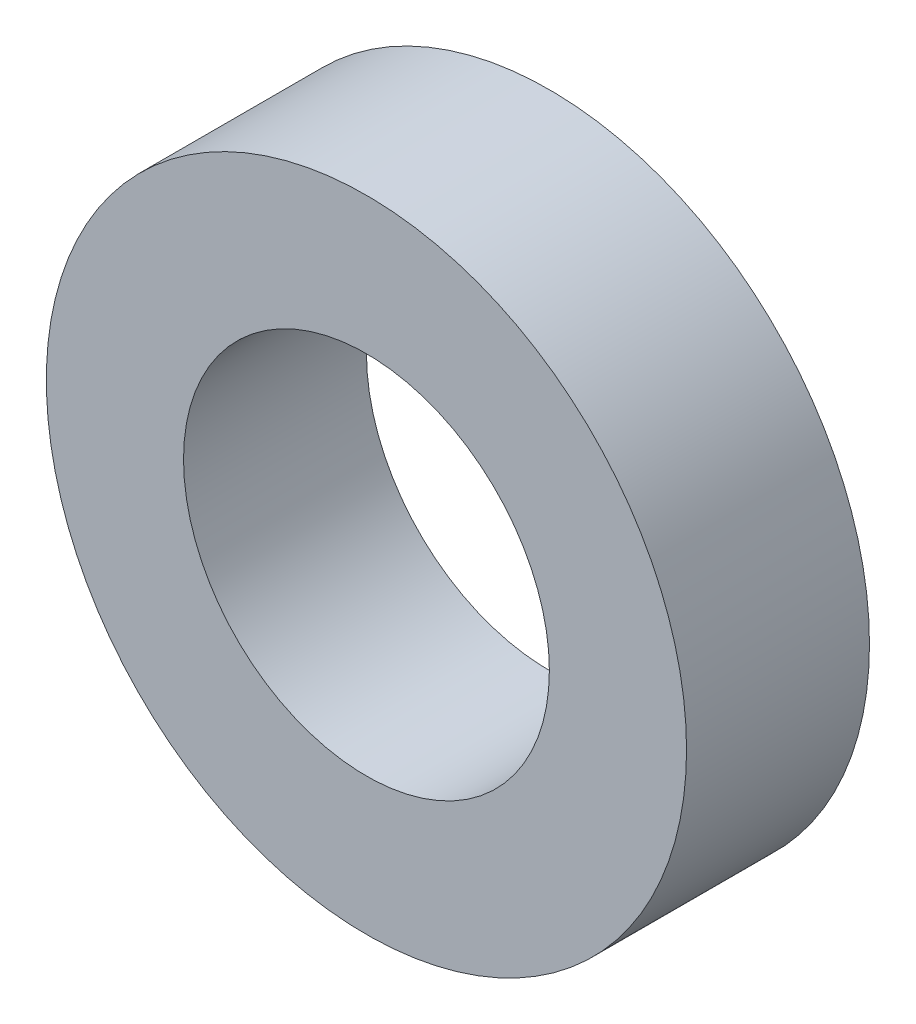
ISO-10303-21;
HEADER;
FILE_DESCRIPTION(('STEP AP214'),'2;1');
FILE_NAME('part.step','',(''),(''),'','','');
FILE_SCHEMA(('AUTOMOTIVE_DESIGN { 1 0 10303 214 1 1 1 1 }'));
ENDSEC;
DATA;
#1=APPLICATION_CONTEXT('core data for automotive mechanical design processes');
#2=APPLICATION_PROTOCOL_DEFINITION('international standard','automotive_design',2000,#1);
#3=PRODUCT_CONTEXT('',#1,'mechanical');
#4=PRODUCT('Part','Part','',(#3));
#5=PRODUCT_RELATED_PRODUCT_CATEGORY('part','',(#4));
#6=PRODUCT_DEFINITION_FORMATION('','',#4);
#7=PRODUCT_DEFINITION_CONTEXT('part definition',#1,'design');
#8=PRODUCT_DEFINITION('design','',#6,#7);
#9=PRODUCT_DEFINITION_SHAPE('','',#8);
#10=(LENGTH_UNIT() NAMED_UNIT(*) SI_UNIT(.MILLI.,.METRE.));
#11=(NAMED_UNIT(*) PLANE_ANGLE_UNIT() SI_UNIT($,.RADIAN.));
#12=(NAMED_UNIT(*) SI_UNIT($,.STERADIAN.) SOLID_ANGLE_UNIT());
#13=UNCERTAINTY_MEASURE_WITH_UNIT(LENGTH_MEASURE(1.E-05),#10,'distance_accuracy_value','');
#14=(GEOMETRIC_REPRESENTATION_CONTEXT(3) GLOBAL_UNCERTAINTY_ASSIGNED_CONTEXT((#13)) GLOBAL_UNIT_ASSIGNED_CONTEXT((#10,
#11,#12)) REPRESENTATION_CONTEXT('',''));
#15=CARTESIAN_POINT('',(0.,0.,0.));
#16=DIRECTION('',(0.,0.,1.));
#17=DIRECTION('',(1.,0.,0.));
#18=AXIS2_PLACEMENT_3D('',#15,#16,#17);
#19=CARTESIAN_POINT('',(0.403421843265389,-40.0666634220305,10.));
#20=DIRECTION('',(0.,0.,1.));
#21=DIRECTION('',(1.,0.,0.));
#22=AXIS2_PLACEMENT_3D('',#19,#20,#21);
#23=PLANE('',#22);
#24=CARTESIAN_POINT('',(0.403421843265389,-40.0666634220305,10.));
#25=DIRECTION('',(0.,0.,1.));
#26=DIRECTION('',(1.,0.,0.));
#27=AXIS2_PLACEMENT_3D('',#24,#25,#26);
#28=CIRCLE('',#27,17.5);
#29=CARTESIAN_POINT('',(17.9034218432654,-40.0666634220305,10.));
#30=VERTEX_POINT('',#29);
#31=EDGE_CURVE('E10',#30,#30,#28,.T.);
#32=ORIENTED_EDGE('',*,*,#31,.T.);
#33=EDGE_LOOP('',(#32));
#34=FACE_BOUND('',#33,.T.);
#35=CARTESIAN_POINT('',(0.403421843265389,-40.0666634220305,10.));
#36=DIRECTION('',(0.,0.,1.));
#37=DIRECTION('',(1.,0.,0.));
#38=AXIS2_PLACEMENT_3D('',#35,#36,#37);
#39=CIRCLE('',#38,10.);
#40=CARTESIAN_POINT('',(10.4034218432654,-40.0666634220305,10.));
#41=VERTEX_POINT('',#40);
#42=EDGE_CURVE('E45',#41,#41,#39,.T.);
#43=ORIENTED_EDGE('',*,*,#42,.F.);
#44=EDGE_LOOP('',(#43));
#45=FACE_BOUND('',#44,.T.);
#46=ADVANCED_FACE('F34',(#34,#45),#23,.T.);
#47=CARTESIAN_POINT('',(0.403421843265389,-40.0666634220305,0.));
#48=DIRECTION('',(0.,0.,1.));
#49=DIRECTION('',(1.,0.,0.));
#50=AXIS2_PLACEMENT_3D('',#47,#48,#49);
#51=PLANE('',#50);
#52=CARTESIAN_POINT('',(0.403421843265389,-40.0666634220305,0.));
#53=DIRECTION('',(0.,0.,1.));
#54=DIRECTION('',(1.,0.,0.));
#55=AXIS2_PLACEMENT_3D('',#52,#53,#54);
#56=CIRCLE('',#55,17.5);
#57=CARTESIAN_POINT('',(17.9034218432654,-40.0666634220305,0.));
#58=VERTEX_POINT('',#57);
#59=EDGE_CURVE('E38',#58,#58,#56,.T.);
#60=ORIENTED_EDGE('',*,*,#59,.F.);
#61=EDGE_LOOP('',(#60));
#62=FACE_BOUND('',#61,.T.);
#63=CARTESIAN_POINT('',(0.403421843265389,-40.0666634220305,0.));
#64=DIRECTION('',(0.,0.,1.));
#65=DIRECTION('',(1.,0.,0.));
#66=AXIS2_PLACEMENT_3D('',#63,#64,#65);
#67=CIRCLE('',#66,10.);
#68=CARTESIAN_POINT('',(10.4034218432654,-40.0666634220305,0.));
#69=VERTEX_POINT('',#68);
#70=EDGE_CURVE('E47',#69,#69,#67,.T.);
#71=ORIENTED_EDGE('',*,*,#70,.T.);
#72=EDGE_LOOP('',(#71));
#73=FACE_BOUND('',#72,.T.);
#74=ADVANCED_FACE('F57',(#62,#73),#51,.F.);
#75=CARTESIAN_POINT('',(0.403421843265389,-40.0666634220305,10.));
#76=DIRECTION('',(0.,0.,-1.));
#77=DIRECTION('',(-1.,0.,0.));
#78=AXIS2_PLACEMENT_3D('',#75,#76,#77);
#79=CYLINDRICAL_SURFACE('',#78,17.5);
#80=ORIENTED_EDGE('',*,*,#31,.F.);
#81=EDGE_LOOP('',(#80));
#82=FACE_BOUND('',#81,.T.);
#83=ORIENTED_EDGE('',*,*,#59,.T.);
#84=EDGE_LOOP('',(#83));
#85=FACE_BOUND('',#84,.T.);
#86=ADVANCED_FACE('F36',(#82,#85),#79,.T.);
#87=CARTESIAN_POINT('',(0.403421843265389,-40.0666634220305,10.));
#88=DIRECTION('',(0.,0.,-1.));
#89=DIRECTION('',(-1.,0.,0.));
#90=AXIS2_PLACEMENT_3D('',#87,#88,#89);
#91=CYLINDRICAL_SURFACE('',#90,10.);
#92=ORIENTED_EDGE('',*,*,#42,.T.);
#93=EDGE_LOOP('',(#92));
#94=FACE_BOUND('',#93,.T.);
#95=ORIENTED_EDGE('',*,*,#70,.F.);
#96=EDGE_LOOP('',(#95));
#97=FACE_BOUND('',#96,.T.);
#98=ADVANCED_FACE('F53',(#94,#97),#91,.F.);
#99=CLOSED_SHELL('',(#46,#74,#86,#98));
#100=MANIFOLD_SOLID_BREP('B2',#99);
#101=ADVANCED_BREP_SHAPE_REPRESENTATION('',(#18,#100),#14);
#102=SHAPE_DEFINITION_REPRESENTATION(#9,#101);
ENDSEC;
END-ISO-10303-21;
